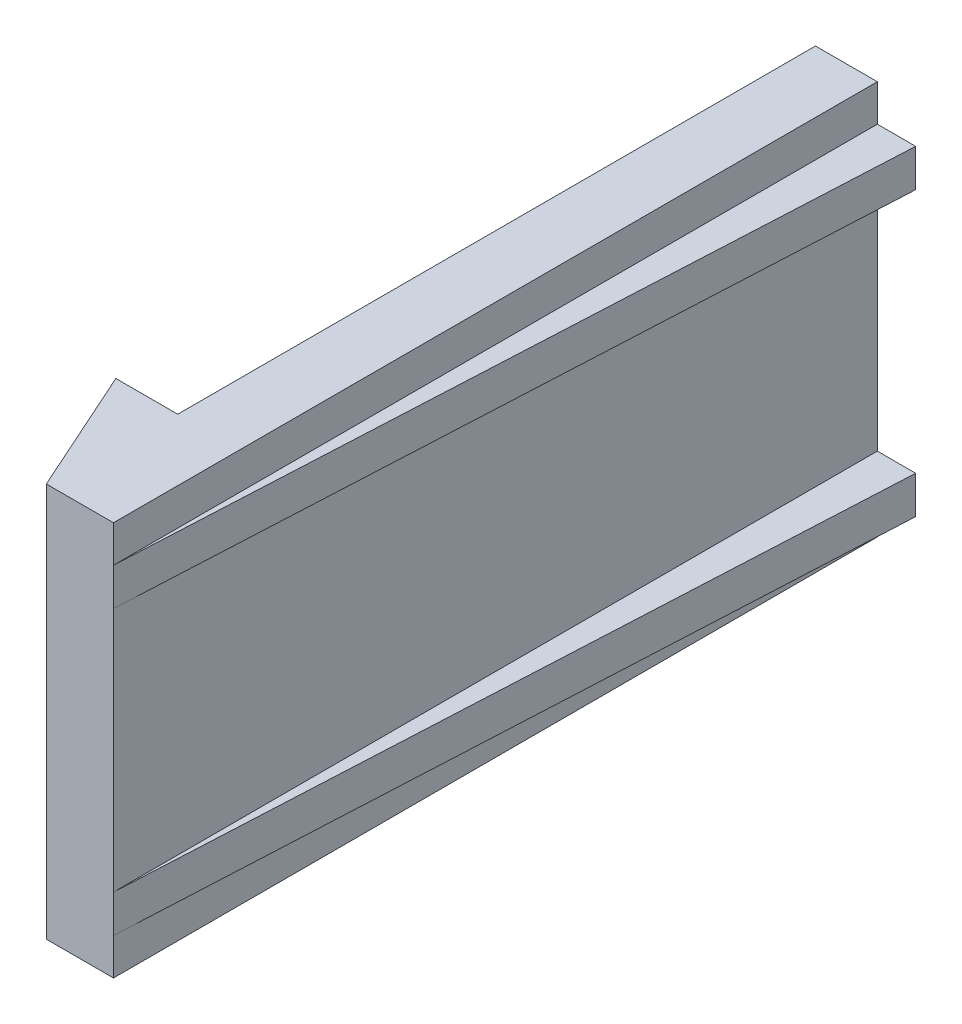
ISO-10303-21;
HEADER;
FILE_DESCRIPTION(('STEP AP214'),'2;1');
FILE_NAME('part.step','',(''),(''),'','','');
FILE_SCHEMA(('AUTOMOTIVE_DESIGN { 1 0 10303 214 1 1 1 1 }'));
ENDSEC;
DATA;
#1=APPLICATION_CONTEXT('core data for automotive mechanical design processes');
#2=APPLICATION_PROTOCOL_DEFINITION('international standard','automotive_design',2000,#1);
#3=PRODUCT_CONTEXT('',#1,'mechanical');
#4=PRODUCT('Part','Part','',(#3));
#5=PRODUCT_RELATED_PRODUCT_CATEGORY('part','',(#4));
#6=PRODUCT_DEFINITION_FORMATION('','',#4);
#7=PRODUCT_DEFINITION_CONTEXT('part definition',#1,'design');
#8=PRODUCT_DEFINITION('design','',#6,#7);
#9=PRODUCT_DEFINITION_SHAPE('','',#8);
#10=(LENGTH_UNIT() NAMED_UNIT(*) SI_UNIT(.MILLI.,.METRE.));
#11=(NAMED_UNIT(*) PLANE_ANGLE_UNIT() SI_UNIT($,.RADIAN.));
#12=(NAMED_UNIT(*) SI_UNIT($,.STERADIAN.) SOLID_ANGLE_UNIT());
#13=UNCERTAINTY_MEASURE_WITH_UNIT(LENGTH_MEASURE(1.E-05),#10,'distance_accuracy_value','');
#14=(GEOMETRIC_REPRESENTATION_CONTEXT(3) GLOBAL_UNCERTAINTY_ASSIGNED_CONTEXT((#13)) GLOBAL_UNIT_ASSIGNED_CONTEXT((#10,
#11,#12)) REPRESENTATION_CONTEXT('',''));
#15=CARTESIAN_POINT('',(0.,0.,0.));
#16=DIRECTION('',(0.,0.,1.));
#17=DIRECTION('',(1.,0.,0.));
#18=AXIS2_PLACEMENT_3D('',#15,#16,#17);
#19=CARTESIAN_POINT('',(137.625273577785,79.358412806806,-0.146018064328788));
#20=DIRECTION('',(0.,0.,-1.));
#21=DIRECTION('',(0.,-1.,0.));
#22=AXIS2_PLACEMENT_3D('',#19,#20,#21);
#23=PLANE('',#22);
#24=DIRECTION('',(0.,1.,0.));
#25=VECTOR('',#24,1.);
#26=CARTESIAN_POINT('',(138.686153307277,75.9776670109203,-0.146018064328788));
#27=LINE('',#26,#25);
#28=CARTESIAN_POINT('',(138.686153307277,75.9776670109203,-0.146018064328788));
#29=VERTEX_POINT('',#28);
#30=CARTESIAN_POINT('',(138.686153307277,76.6085029337508,-0.146018064328788));
#31=VERTEX_POINT('',#30);
#32=EDGE_CURVE('E215',#29,#31,#27,.T.);
#33=ORIENTED_EDGE('',*,*,#32,.F.);
#34=DIRECTION('',(1.,0.,0.));
#35=VECTOR('',#34,1.);
#36=CARTESIAN_POINT('',(137.625273577785,75.9776670109203,-0.146018064328788));
#37=LINE('',#36,#35);
#38=CARTESIAN_POINT('',(137.625273577785,75.9776670109203,-0.146018064328788));
#39=VERTEX_POINT('',#38);
#40=EDGE_CURVE('E82',#39,#29,#37,.T.);
#41=ORIENTED_EDGE('',*,*,#40,.F.);
#42=DIRECTION('',(0.,-1.,0.));
#43=VECTOR('',#42,1.);
#44=CARTESIAN_POINT('',(137.625273577785,82.7391586026916,-0.146018064328788));
#45=LINE('',#44,#43);
#46=CARTESIAN_POINT('',(137.625273577785,82.7391586026916,-0.146018064328788));
#47=VERTEX_POINT('',#46);
#48=EDGE_CURVE('E208',#47,#39,#45,.T.);
#49=ORIENTED_EDGE('',*,*,#48,.F.);
#50=DIRECTION('',(-1.,0.,0.));
#51=VECTOR('',#50,1.);
#52=CARTESIAN_POINT('',(138.686153307277,82.7391586026916,-0.146018064328788));
#53=LINE('',#52,#51);
#54=CARTESIAN_POINT('',(138.686153307277,82.7391586026916,-0.146018064328788));
#55=VERTEX_POINT('',#54);
#56=EDGE_CURVE('E50',#55,#47,#53,.T.);
#57=ORIENTED_EDGE('',*,*,#56,.F.);
#58=DIRECTION('',(0.,1.,0.));
#59=VECTOR('',#58,1.);
#60=CARTESIAN_POINT('',(138.686153307277,82.1083226798611,-0.146018064328788));
#61=LINE('',#60,#59);
#62=CARTESIAN_POINT('',(138.686153307277,82.1083226798611,-0.146018064328788));
#63=VERTEX_POINT('',#62);
#64=EDGE_CURVE('E213',#63,#55,#61,.T.);
#65=ORIENTED_EDGE('',*,*,#64,.F.);
#66=DIRECTION('',(1.,0.,0.));
#67=VECTOR('',#66,1.);
#68=CARTESIAN_POINT('',(138.686153307277,82.1083226798611,-0.146018064328788));
#69=LINE('',#68,#67);
#70=CARTESIAN_POINT('',(139.343903442515,82.1083226798611,-0.146018064328788));
#71=VERTEX_POINT('',#70);
#72=EDGE_CURVE('E155',#63,#71,#69,.T.);
#73=ORIENTED_EDGE('',*,*,#72,.T.);
#74=DIRECTION('',(0.,-1.,0.));
#75=VECTOR('',#74,1.);
#76=CARTESIAN_POINT('',(139.343903442515,82.1083226798611,-0.146018064328788));
#77=LINE('',#76,#75);
#78=CARTESIAN_POINT('',(139.343903442515,81.4641056681932,-0.146018064328788));
#79=VERTEX_POINT('',#78);
#80=EDGE_CURVE('E159',#71,#79,#77,.T.);
#81=ORIENTED_EDGE('',*,*,#80,.T.);
#82=DIRECTION('',(-1.,0.,0.));
#83=VECTOR('',#82,1.);
#84=CARTESIAN_POINT('',(139.343903442515,81.4641056681932,-0.146018064328788));
#85=LINE('',#84,#83);
#86=CARTESIAN_POINT('',(138.686153307277,81.4641056681932,-0.146018064328788));
#87=VERTEX_POINT('',#86);
#88=EDGE_CURVE('E231',#79,#87,#85,.T.);
#89=ORIENTED_EDGE('',*,*,#88,.T.);
#90=DIRECTION('',(0.,1.,0.));
#91=VECTOR('',#90,1.);
#92=CARTESIAN_POINT('',(138.686153307277,77.2527199454188,-0.146018064328788));
#93=LINE('',#92,#91);
#94=CARTESIAN_POINT('',(138.686153307277,77.2527199454188,-0.146018064328788));
#95=VERTEX_POINT('',#94);
#96=EDGE_CURVE('E202',#95,#87,#93,.T.);
#97=ORIENTED_EDGE('',*,*,#96,.F.);
#98=DIRECTION('',(-1.,0.,0.));
#99=VECTOR('',#98,1.);
#100=CARTESIAN_POINT('',(139.343903442515,77.2527199454188,-0.146018064328788));
#101=LINE('',#100,#99);
#102=CARTESIAN_POINT('',(139.343903442515,77.2527199454188,-0.146018064328788));
#103=VERTEX_POINT('',#102);
#104=EDGE_CURVE('E200',#103,#95,#101,.T.);
#105=ORIENTED_EDGE('',*,*,#104,.F.);
#106=DIRECTION('',(0.,1.,0.));
#107=VECTOR('',#106,1.);
#108=CARTESIAN_POINT('',(139.343903442515,76.6085029337508,-0.146018064328788));
#109=LINE('',#108,#107);
#110=CARTESIAN_POINT('',(139.343903442515,76.6085029337508,-0.146018064328788));
#111=VERTEX_POINT('',#110);
#112=EDGE_CURVE('E229',#111,#103,#109,.T.);
#113=ORIENTED_EDGE('',*,*,#112,.F.);
#114=DIRECTION('',(1.,0.,0.));
#115=VECTOR('',#114,1.);
#116=CARTESIAN_POINT('',(138.686153307277,76.6085029337508,-0.146018064328788));
#117=LINE('',#116,#115);
#118=EDGE_CURVE('E218',#31,#111,#117,.T.);
#119=ORIENTED_EDGE('',*,*,#118,.F.);
#120=EDGE_LOOP('',(#33,#41,#49,#57,#65,#73,#81,#89,#97,#105,#113,#119));
#121=FACE_BOUND('',#120,.T.);
#122=ADVANCED_FACE('F40',(#121),#23,.T.);
#123=CARTESIAN_POINT('',(138.110248464515,75.9776670109203,12.9541868733687));
#124=DIRECTION('',(0.,0.,1.));
#125=DIRECTION('',(1.,0.,0.));
#126=AXIS2_PLACEMENT_3D('',#123,#124,#125);
#127=PLANE('',#126);
#128=DIRECTION('',(0.,1.,0.));
#129=VECTOR('',#128,1.);
#130=CARTESIAN_POINT('',(138.686153307277,82.1083226798611,12.9541868733687));
#131=LINE('',#130,#129);
#132=CARTESIAN_POINT('',(138.686153307277,82.1083226798611,12.9541868733687));
#133=VERTEX_POINT('',#132);
#134=CARTESIAN_POINT('',(138.686153307277,82.7391586026916,12.9541868733687));
#135=VERTEX_POINT('',#134);
#136=EDGE_CURVE('E129',#133,#135,#131,.T.);
#137=ORIENTED_EDGE('',*,*,#136,.T.);
#138=DIRECTION('',(-1.,0.,0.));
#139=VECTOR('',#138,1.);
#140=CARTESIAN_POINT('',(138.686153307277,82.7391586026916,12.9541868733687));
#141=LINE('',#140,#139);
#142=CARTESIAN_POINT('',(137.534343621753,82.7391586026916,12.9541868733687));
#143=VERTEX_POINT('',#142);
#144=EDGE_CURVE('E11',#135,#143,#141,.T.);
#145=ORIENTED_EDGE('',*,*,#144,.T.);
#146=DIRECTION('',(0.,-1.,0.));
#147=VECTOR('',#146,1.);
#148=CARTESIAN_POINT('',(137.534343621753,82.7391586026916,12.9541868733687));
#149=LINE('',#148,#147);
#150=CARTESIAN_POINT('',(137.534343621753,75.9776670109203,12.9541868733687));
#151=VERTEX_POINT('',#150);
#152=EDGE_CURVE('E168',#143,#151,#149,.T.);
#153=ORIENTED_EDGE('',*,*,#152,.T.);
#154=DIRECTION('',(1.,0.,0.));
#155=VECTOR('',#154,1.);
#156=CARTESIAN_POINT('',(137.534343621753,75.9776670109203,12.9541868733687));
#157=LINE('',#156,#155);
#158=CARTESIAN_POINT('',(138.686153307277,75.9776670109203,12.9541868733687));
#159=VERTEX_POINT('',#158);
#160=EDGE_CURVE('E175',#151,#159,#157,.T.);
#161=ORIENTED_EDGE('',*,*,#160,.T.);
#162=DIRECTION('',(0.,1.,0.));
#163=VECTOR('',#162,1.);
#164=CARTESIAN_POINT('',(138.686153307277,75.9776670109203,12.9541868733687));
#165=LINE('',#164,#163);
#166=CARTESIAN_POINT('',(138.686153307277,76.6085029337508,12.9541868733687));
#167=VERTEX_POINT('',#166);
#168=EDGE_CURVE('E203',#159,#167,#165,.T.);
#169=ORIENTED_EDGE('',*,*,#168,.T.);
#170=DIRECTION('',(0.,1.,0.));
#171=VECTOR('',#170,1.);
#172=CARTESIAN_POINT('',(138.686153307277,76.6085029337508,12.9541868733687));
#173=LINE('',#172,#171);
#174=CARTESIAN_POINT('',(138.686153307277,77.2527199454188,12.9541868733687));
#175=VERTEX_POINT('',#174);
#176=EDGE_CURVE('E205',#167,#175,#173,.T.);
#177=ORIENTED_EDGE('',*,*,#176,.T.);
#178=DIRECTION('',(0.,1.,0.));
#179=VECTOR('',#178,1.);
#180=CARTESIAN_POINT('',(138.686153307277,77.2527199454188,12.9541868733687));
#181=LINE('',#180,#179);
#182=CARTESIAN_POINT('',(138.686153307277,81.4641056681932,12.9541868733687));
#183=VERTEX_POINT('',#182);
#184=EDGE_CURVE('E143',#175,#183,#181,.T.);
#185=ORIENTED_EDGE('',*,*,#184,.T.);
#186=DIRECTION('',(0.,1.,0.));
#187=VECTOR('',#186,1.);
#188=CARTESIAN_POINT('',(138.686153307277,81.4641056681932,12.9541868733687));
#189=LINE('',#188,#187);
#190=EDGE_CURVE('E140',#183,#133,#189,.T.);
#191=ORIENTED_EDGE('',*,*,#190,.T.);
#192=EDGE_LOOP('',(#137,#145,#153,#161,#169,#177,#185,#191));
#193=FACE_BOUND('',#192,.T.);
#194=ADVANCED_FACE('F141',(#193),#127,.T.);
#195=CARTESIAN_POINT('',(137.625273577785,82.7391586026916,-0.146018064328788));
#196=DIRECTION('',(0.,1.,0.));
#197=DIRECTION('',(1.,0.,0.));
#198=AXIS2_PLACEMENT_3D('',#195,#196,#197);
#199=PLANE('',#198);
#200=ORIENTED_EDGE('',*,*,#56,.T.);
#201=DIRECTION('',(0.,0.,1.));
#202=VECTOR('',#201,1.);
#203=CARTESIAN_POINT('',(137.625273577785,82.7391586026916,-0.146018064328788));
#204=LINE('',#203,#202);
#205=CARTESIAN_POINT('',(137.625273577785,82.7391586026916,10.7911629662266));
#206=VERTEX_POINT('',#205);
#207=EDGE_CURVE('E44',#47,#206,#204,.T.);
#208=ORIENTED_EDGE('',*,*,#207,.T.);
#209=DIRECTION('',(-1.,0.,0.));
#210=VECTOR('',#209,1.);
#211=CARTESIAN_POINT('',(137.625273577785,82.7391586026916,10.7911629662266));
#212=LINE('',#211,#210);
#213=CARTESIAN_POINT('',(136.564393848293,82.7391586026916,10.7911629662266));
#214=VERTEX_POINT('',#213);
#215=EDGE_CURVE('E171',#206,#214,#212,.T.);
#216=ORIENTED_EDGE('',*,*,#215,.T.);
#217=DIRECTION('',(0.40916773004546,0.,0.91245918741029));
#218=VECTOR('',#217,1.);
#219=CARTESIAN_POINT('',(136.564393848293,82.7391586026916,10.7911629662266));
#220=LINE('',#219,#218);
#221=EDGE_CURVE('E170',#214,#143,#220,.T.);
#222=ORIENTED_EDGE('',*,*,#221,.T.);
#223=ORIENTED_EDGE('',*,*,#144,.F.);
#224=DIRECTION('',(0.,0.,1.));
#225=VECTOR('',#224,1.);
#226=CARTESIAN_POINT('',(138.686153307277,82.7391586026916,-0.146018064328788));
#227=LINE('',#226,#225);
#228=EDGE_CURVE('E136',#55,#135,#227,.T.);
#229=ORIENTED_EDGE('',*,*,#228,.F.);
#230=EDGE_LOOP('',(#200,#208,#216,#222,#223,#229));
#231=FACE_BOUND('',#230,.T.);
#232=ADVANCED_FACE('F276',(#231),#199,.T.);
#233=CARTESIAN_POINT('',(137.625273577785,75.9776670109203,-0.146018064328788));
#234=DIRECTION('',(0.,-1.,0.));
#235=DIRECTION('',(0.,0.,-1.));
#236=AXIS2_PLACEMENT_3D('',#233,#234,#235);
#237=PLANE('',#236);
#238=ORIENTED_EDGE('',*,*,#40,.T.);
#239=DIRECTION('',(0.,0.,1.));
#240=VECTOR('',#239,1.);
#241=CARTESIAN_POINT('',(138.686153307277,75.9776670109203,-0.146018064328788));
#242=LINE('',#241,#240);
#243=EDGE_CURVE('E188',#29,#159,#242,.T.);
#244=ORIENTED_EDGE('',*,*,#243,.T.);
#245=ORIENTED_EDGE('',*,*,#160,.F.);
#246=DIRECTION('',(0.40916773004546,0.,0.91245918741029));
#247=VECTOR('',#246,1.);
#248=CARTESIAN_POINT('',(136.564393848293,75.9776670109203,10.7911629662266));
#249=LINE('',#248,#247);
#250=CARTESIAN_POINT('',(136.564393848293,75.9776670109203,10.7911629662266));
#251=VERTEX_POINT('',#250);
#252=EDGE_CURVE('E165',#251,#151,#249,.T.);
#253=ORIENTED_EDGE('',*,*,#252,.F.);
#254=DIRECTION('',(1.,0.,0.));
#255=VECTOR('',#254,1.);
#256=CARTESIAN_POINT('',(136.564393848293,75.9776670109203,10.7911629662266));
#257=LINE('',#256,#255);
#258=CARTESIAN_POINT('',(137.625273577785,75.9776670109203,10.7911629662266));
#259=VERTEX_POINT('',#258);
#260=EDGE_CURVE('E185',#251,#259,#257,.T.);
#261=ORIENTED_EDGE('',*,*,#260,.T.);
#262=DIRECTION('',(0.,0.,1.));
#263=VECTOR('',#262,1.);
#264=CARTESIAN_POINT('',(137.625273577785,75.9776670109203,-0.146018064328788));
#265=LINE('',#264,#263);
#266=EDGE_CURVE('E211',#39,#259,#265,.T.);
#267=ORIENTED_EDGE('',*,*,#266,.F.);
#268=EDGE_LOOP('',(#238,#244,#245,#253,#261,#267));
#269=FACE_BOUND('',#268,.T.);
#270=ADVANCED_FACE('F184',(#269),#237,.T.);
#271=CARTESIAN_POINT('',(138.686153307277,79.358412806806,5.30512976287969));
#272=DIRECTION('',(1.,0.,0.));
#273=DIRECTION('',(0.,1.,0.));
#274=AXIS2_PLACEMENT_3D('',#271,#272,#273);
#275=PLANE('',#274);
#276=DIRECTION('',(0.,0.,-1.));
#277=VECTOR('',#276,1.);
#278=CARTESIAN_POINT('',(138.686153307277,82.1083226798611,12.9541868733687));
#279=LINE('',#278,#277);
#280=EDGE_CURVE('E134',#133,#63,#279,.T.);
#281=ORIENTED_EDGE('',*,*,#280,.T.);
#282=ORIENTED_EDGE('',*,*,#64,.T.);
#283=ORIENTED_EDGE('',*,*,#228,.T.);
#284=ORIENTED_EDGE('',*,*,#136,.F.);
#285=EDGE_LOOP('',(#281,#282,#283,#284));
#286=FACE_BOUND('',#285,.T.);
#287=ADVANCED_FACE('F131',(#286),#275,.T.);
#288=CARTESIAN_POINT('',(138.686153307277,79.358412806806,5.30512976287969));
#289=DIRECTION('',(1.,0.,0.));
#290=DIRECTION('',(0.,1.,0.));
#291=AXIS2_PLACEMENT_3D('',#288,#289,#290);
#292=PLANE('',#291);
#293=ORIENTED_EDGE('',*,*,#168,.F.);
#294=ORIENTED_EDGE('',*,*,#243,.F.);
#295=ORIENTED_EDGE('',*,*,#32,.T.);
#296=DIRECTION('',(0.,0.,-1.));
#297=VECTOR('',#296,1.);
#298=CARTESIAN_POINT('',(138.686153307277,76.6085029337508,12.9541868733687));
#299=LINE('',#298,#297);
#300=EDGE_CURVE('E222',#167,#31,#299,.T.);
#301=ORIENTED_EDGE('',*,*,#300,.F.);
#302=EDGE_LOOP('',(#293,#294,#295,#301));
#303=FACE_BOUND('',#302,.T.);
#304=ADVANCED_FACE('F42',(#303),#292,.T.);
#305=CARTESIAN_POINT('',(138.686153307277,79.358412806806,5.30512976287969));
#306=DIRECTION('',(1.,0.,0.));
#307=DIRECTION('',(0.,1.,0.));
#308=AXIS2_PLACEMENT_3D('',#305,#306,#307);
#309=PLANE('',#308);
#310=DIRECTION('',(0.,0.,1.));
#311=VECTOR('',#310,1.);
#312=CARTESIAN_POINT('',(138.686153307277,81.4641056681932,-0.146018064328788));
#313=LINE('',#312,#311);
#314=EDGE_CURVE('E235',#87,#183,#313,.T.);
#315=ORIENTED_EDGE('',*,*,#314,.T.);
#316=ORIENTED_EDGE('',*,*,#184,.F.);
#317=DIRECTION('',(0.,0.,1.));
#318=VECTOR('',#317,1.);
#319=CARTESIAN_POINT('',(138.686153307277,77.2527199454188,-0.146018064328788));
#320=LINE('',#319,#318);
#321=EDGE_CURVE('E164',#95,#175,#320,.T.);
#322=ORIENTED_EDGE('',*,*,#321,.F.);
#323=ORIENTED_EDGE('',*,*,#96,.T.);
#324=EDGE_LOOP('',(#315,#316,#322,#323));
#325=FACE_BOUND('',#324,.T.);
#326=ADVANCED_FACE('F293',(#325),#309,.T.);
#327=CARTESIAN_POINT('',(136.564393848293,75.9776670109203,10.7911629662266));
#328=DIRECTION('',(0.,0.,-1.));
#329=DIRECTION('',(0.,-1.,0.));
#330=AXIS2_PLACEMENT_3D('',#327,#328,#329);
#331=PLANE('',#330);
#332=DIRECTION('',(0.,-1.,0.));
#333=VECTOR('',#332,1.);
#334=CARTESIAN_POINT('',(136.564393848293,82.7391586026916,10.7911629662266));
#335=LINE('',#334,#333);
#336=EDGE_CURVE('E169',#214,#251,#335,.T.);
#337=ORIENTED_EDGE('',*,*,#336,.F.);
#338=ORIENTED_EDGE('',*,*,#215,.F.);
#339=DIRECTION('',(0.,1.,0.));
#340=VECTOR('',#339,1.);
#341=CARTESIAN_POINT('',(137.625273577785,75.9776670109203,10.7911629662266));
#342=LINE('',#341,#340);
#343=EDGE_CURVE('E198',#259,#206,#342,.T.);
#344=ORIENTED_EDGE('',*,*,#343,.F.);
#345=ORIENTED_EDGE('',*,*,#260,.F.);
#346=EDGE_LOOP('',(#337,#338,#344,#345));
#347=FACE_BOUND('',#346,.T.);
#348=ADVANCED_FACE('F288',(#347),#331,.T.);
#349=CARTESIAN_POINT('',(136.564393848293,79.358412806806,10.7911629662266));
#350=DIRECTION('',(-0.912459187410287,0.,0.409167730045466));
#351=DIRECTION('',(0.,1.,0.));
#352=AXIS2_PLACEMENT_3D('',#349,#350,#351);
#353=PLANE('',#352);
#354=ORIENTED_EDGE('',*,*,#336,.T.);
#355=ORIENTED_EDGE('',*,*,#252,.T.);
#356=ORIENTED_EDGE('',*,*,#152,.F.);
#357=ORIENTED_EDGE('',*,*,#221,.F.);
#358=EDGE_LOOP('',(#354,#355,#356,#357));
#359=FACE_BOUND('',#358,.T.);
#360=ADVANCED_FACE('F181',(#359),#353,.T.);
#361=CARTESIAN_POINT('',(137.625273577785,79.358412806806,5.30512976287969));
#362=DIRECTION('',(-1.,0.,0.));
#363=DIRECTION('',(0.,0.,1.));
#364=AXIS2_PLACEMENT_3D('',#361,#362,#363);
#365=PLANE('',#364);
#366=ORIENTED_EDGE('',*,*,#343,.T.);
#367=ORIENTED_EDGE('',*,*,#207,.F.);
#368=ORIENTED_EDGE('',*,*,#48,.T.);
#369=ORIENTED_EDGE('',*,*,#266,.T.);
#370=EDGE_LOOP('',(#366,#367,#368,#369));
#371=FACE_BOUND('',#370,.T.);
#372=ADVANCED_FACE('F280',(#371),#365,.T.);
#373=CARTESIAN_POINT('',(139.015028374896,77.2527199454188,6.40408440451998));
#374=DIRECTION('',(0.,1.,0.));
#375=DIRECTION('',(1.,0.,0.));
#376=AXIS2_PLACEMENT_3D('',#373,#374,#375);
#377=PLANE('',#376);
#378=ORIENTED_EDGE('',*,*,#321,.T.);
#379=DIRECTION('',(-0.0501459803267958,0.,0.998741898919368));
#380=VECTOR('',#379,1.);
#381=CARTESIAN_POINT('',(139.343903442515,77.2527199454188,-0.146018064328788));
#382=LINE('',#381,#380);
#383=EDGE_CURVE('E207',#103,#175,#382,.T.);
#384=ORIENTED_EDGE('',*,*,#383,.F.);
#385=ORIENTED_EDGE('',*,*,#104,.T.);
#386=EDGE_LOOP('',(#378,#384,#385));
#387=FACE_BOUND('',#386,.T.);
#388=ADVANCED_FACE('F254',(#387),#377,.T.);
#389=CARTESIAN_POINT('',(139.343903442515,76.9306114395848,-0.146018064328788));
#390=DIRECTION('',(0.998741898919368,0.,0.0501459803267945));
#391=DIRECTION('',(0.,-1.,0.));
#392=AXIS2_PLACEMENT_3D('',#389,#390,#391);
#393=PLANE('',#392);
#394=ORIENTED_EDGE('',*,*,#112,.T.);
#395=ORIENTED_EDGE('',*,*,#383,.T.);
#396=ORIENTED_EDGE('',*,*,#176,.F.);
#397=DIRECTION('',(-0.0501459803267958,0.,0.998741898919368));
#398=VECTOR('',#397,1.);
#399=CARTESIAN_POINT('',(139.343903442515,76.6085029337508,-0.146018064328788));
#400=LINE('',#399,#398);
#401=EDGE_CURVE('E221',#111,#167,#400,.T.);
#402=ORIENTED_EDGE('',*,*,#401,.F.);
#403=EDGE_LOOP('',(#394,#395,#396,#402));
#404=FACE_BOUND('',#403,.T.);
#405=ADVANCED_FACE('F251',(#404),#393,.T.);
#406=CARTESIAN_POINT('',(138.283023713024,76.6085029337508,6.40408440451998));
#407=DIRECTION('',(0.,-1.,0.));
#408=DIRECTION('',(0.,0.,-1.));
#409=AXIS2_PLACEMENT_3D('',#406,#407,#408);
#410=PLANE('',#409);
#411=ORIENTED_EDGE('',*,*,#300,.T.);
#412=ORIENTED_EDGE('',*,*,#118,.T.);
#413=ORIENTED_EDGE('',*,*,#401,.T.);
#414=EDGE_LOOP('',(#411,#412,#413));
#415=FACE_BOUND('',#414,.T.);
#416=ADVANCED_FACE('F258',(#415),#410,.T.);
#417=CARTESIAN_POINT('',(138.48458851015,81.4641056681932,12.9541868733687));
#418=DIRECTION('',(0.,-1.,0.));
#419=DIRECTION('',(0.,0.,-1.));
#420=AXIS2_PLACEMENT_3D('',#417,#418,#419);
#421=PLANE('',#420);
#422=ORIENTED_EDGE('',*,*,#88,.F.);
#423=DIRECTION('',(-0.0501459803267958,0.,0.998741898919368));
#424=VECTOR('',#423,1.);
#425=CARTESIAN_POINT('',(139.343903442515,81.4641056681932,-0.146018064328788));
#426=LINE('',#425,#424);
#427=EDGE_CURVE('E148',#79,#183,#426,.T.);
#428=ORIENTED_EDGE('',*,*,#427,.T.);
#429=ORIENTED_EDGE('',*,*,#314,.F.);
#430=EDGE_LOOP('',(#422,#428,#429));
#431=FACE_BOUND('',#430,.T.);
#432=ADVANCED_FACE('F260',(#431),#421,.T.);
#433=CARTESIAN_POINT('',(139.015028374896,82.1083226798611,6.40408440451998));
#434=DIRECTION('',(0.998741898919368,0.,0.0501459803267945));
#435=DIRECTION('',(0.,-1.,0.));
#436=AXIS2_PLACEMENT_3D('',#433,#434,#435);
#437=PLANE('',#436);
#438=DIRECTION('',(-0.0501459803267958,0.,0.998741898919368));
#439=VECTOR('',#438,1.);
#440=CARTESIAN_POINT('',(139.343903442515,82.1083226798611,-0.146018064328788));
#441=LINE('',#440,#439);
#442=EDGE_CURVE('E153',#71,#133,#441,.T.);
#443=ORIENTED_EDGE('',*,*,#442,.T.);
#444=ORIENTED_EDGE('',*,*,#190,.F.);
#445=ORIENTED_EDGE('',*,*,#427,.F.);
#446=ORIENTED_EDGE('',*,*,#80,.F.);
#447=EDGE_LOOP('',(#443,#444,#445,#446));
#448=FACE_BOUND('',#447,.T.);
#449=ADVANCED_FACE('F157',(#448),#437,.T.);
#450=CARTESIAN_POINT('',(138.48458851015,82.1083226798611,12.9541868733687));
#451=DIRECTION('',(0.,1.,0.));
#452=DIRECTION('',(1.,0.,0.));
#453=AXIS2_PLACEMENT_3D('',#450,#451,#452);
#454=PLANE('',#453);
#455=ORIENTED_EDGE('',*,*,#442,.F.);
#456=ORIENTED_EDGE('',*,*,#72,.F.);
#457=ORIENTED_EDGE('',*,*,#280,.F.);
#458=EDGE_LOOP('',(#455,#456,#457));
#459=FACE_BOUND('',#458,.T.);
#460=ADVANCED_FACE('F152',(#459),#454,.T.);
#461=CLOSED_SHELL('',(#122,#194,#232,#270,#287,#304,#326,#348,#360,#372,#388,#405,#416,#432,
#449,#460));
#462=MANIFOLD_SOLID_BREP('B2',#461);
#463=ADVANCED_BREP_SHAPE_REPRESENTATION('',(#18,#462),#14);
#464=SHAPE_DEFINITION_REPRESENTATION(#9,#463);
ENDSEC;
END-ISO-10303-21;
